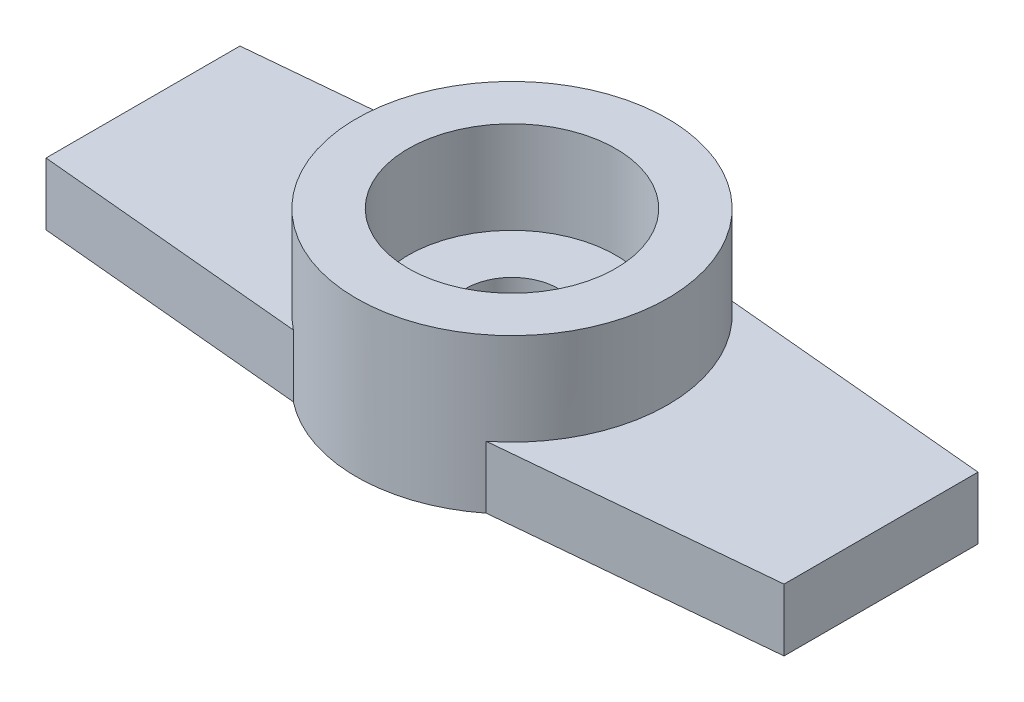
ISO-10303-21;
HEADER;
FILE_DESCRIPTION(('STEP AP214'),'2;1');
FILE_NAME('part.step','',(''),(''),'','','');
FILE_SCHEMA(('AUTOMOTIVE_DESIGN { 1 0 10303 214 1 1 1 1 }'));
ENDSEC;
DATA;
#1=APPLICATION_CONTEXT('core data for automotive mechanical design processes');
#2=APPLICATION_PROTOCOL_DEFINITION('international standard','automotive_design',2000,#1);
#3=PRODUCT_CONTEXT('',#1,'mechanical');
#4=PRODUCT('Part','Part','',(#3));
#5=PRODUCT_RELATED_PRODUCT_CATEGORY('part','',(#4));
#6=PRODUCT_DEFINITION_FORMATION('','',#4);
#7=PRODUCT_DEFINITION_CONTEXT('part definition',#1,'design');
#8=PRODUCT_DEFINITION('design','',#6,#7);
#9=PRODUCT_DEFINITION_SHAPE('','',#8);
#10=(LENGTH_UNIT() NAMED_UNIT(*) SI_UNIT(.MILLI.,.METRE.));
#11=(NAMED_UNIT(*) PLANE_ANGLE_UNIT() SI_UNIT($,.RADIAN.));
#12=(NAMED_UNIT(*) SI_UNIT($,.STERADIAN.) SOLID_ANGLE_UNIT());
#13=UNCERTAINTY_MEASURE_WITH_UNIT(LENGTH_MEASURE(1.E-05),#10,'distance_accuracy_value','');
#14=(GEOMETRIC_REPRESENTATION_CONTEXT(3) GLOBAL_UNCERTAINTY_ASSIGNED_CONTEXT((#13)) GLOBAL_UNIT_ASSIGNED_CONTEXT((#10,
#11,#12)) REPRESENTATION_CONTEXT('',''));
#15=CARTESIAN_POINT('',(0.,0.,0.));
#16=DIRECTION('',(0.,0.,1.));
#17=DIRECTION('',(1.,0.,0.));
#18=AXIS2_PLACEMENT_3D('',#15,#16,#17);
#19=CARTESIAN_POINT('',(0.,1.35,0.));
#20=DIRECTION('',(0.,1.,0.));
#21=DIRECTION('',(0.,0.,1.));
#22=AXIS2_PLACEMENT_3D('',#19,#20,#21);
#23=PLANE('',#22);
#24=CARTESIAN_POINT('',(0.,1.35,0.));
#25=DIRECTION('',(0.,1.,0.));
#26=DIRECTION('',(0.,0.,1.));
#27=AXIS2_PLACEMENT_3D('',#24,#25,#26);
#28=CIRCLE('',#27,3.375);
#29=CARTESIAN_POINT('',(2.09000598085269,1.35,2.65));
#30=VERTEX_POINT('',#29);
#31=CARTESIAN_POINT('',(2.09000598085269,1.35,-2.65));
#32=VERTEX_POINT('',#31);
#33=EDGE_CURVE('E47',#30,#32,#28,.T.);
#34=ORIENTED_EDGE('',*,*,#33,.F.);
#35=DIRECTION('',(0.995733846741475,0.,-0.0922719158434676));
#36=VECTOR('',#35,1.);
#37=CARTESIAN_POINT('',(0.26127194813818,1.35,2.81946375110068));
#38=LINE('',#37,#36);
#39=CARTESIAN_POINT('',(8.,1.35,2.10233711543026));
#40=VERTEX_POINT('',#39);
#41=EDGE_CURVE('E127',#30,#40,#38,.T.);
#42=ORIENTED_EDGE('',*,*,#41,.T.);
#43=DIRECTION('',(0.,0.,-1.));
#44=VECTOR('',#43,1.);
#45=CARTESIAN_POINT('',(8.,1.35,0.));
#46=LINE('',#45,#44);
#47=CARTESIAN_POINT('',(8.,1.35,-2.10233711543026));
#48=VERTEX_POINT('',#47);
#49=EDGE_CURVE('E55',#40,#48,#46,.T.);
#50=ORIENTED_EDGE('',*,*,#49,.T.);
#51=DIRECTION('',(0.995733846741475,0.,0.0922719158434676));
#52=VECTOR('',#51,1.);
#53=CARTESIAN_POINT('',(0.26127194813818,1.35,-2.81946375110068));
#54=LINE('',#53,#52);
#55=EDGE_CURVE('E143',#32,#48,#54,.T.);
#56=ORIENTED_EDGE('',*,*,#55,.F.);
#57=EDGE_LOOP('',(#34,#42,#50,#56));
#58=FACE_BOUND('',#57,.T.);
#59=ADVANCED_FACE('F36',(#58),#23,.T.);
#60=CARTESIAN_POINT('',(0.26127194813818,1.35,-2.81946375110068));
#61=DIRECTION('',(0.0922719158434675,0.,-0.995733846741475));
#62=DIRECTION('',(-0.995733846741475,0.,-0.0922719158434676));
#63=AXIS2_PLACEMENT_3D('',#60,#61,#62);
#64=PLANE('',#63);
#65=DIRECTION('',(0.995733846741475,0.,0.0922719158434676));
#66=VECTOR('',#65,1.);
#67=CARTESIAN_POINT('',(0.26127194813818,0.,-2.81946375110068));
#68=LINE('',#67,#66);
#69=CARTESIAN_POINT('',(2.09000598085269,0.,-2.65));
#70=VERTEX_POINT('',#69);
#71=CARTESIAN_POINT('',(8.,0.,-2.10233711543026));
#72=VERTEX_POINT('',#71);
#73=EDGE_CURVE('E151',#70,#72,#68,.T.);
#74=ORIENTED_EDGE('',*,*,#73,.F.);
#75=DIRECTION('',(0.,-1.,0.));
#76=VECTOR('',#75,1.);
#77=CARTESIAN_POINT('',(2.09000598085269,1.35,-2.65));
#78=LINE('',#77,#76);
#79=EDGE_CURVE('E40',#32,#70,#78,.T.);
#80=ORIENTED_EDGE('',*,*,#79,.F.);
#81=ORIENTED_EDGE('',*,*,#55,.T.);
#82=DIRECTION('',(0.,-1.,0.));
#83=VECTOR('',#82,1.);
#84=CARTESIAN_POINT('',(8.,1.35,-2.10233711543026));
#85=LINE('',#84,#83);
#86=EDGE_CURVE('E92',#48,#72,#85,.T.);
#87=ORIENTED_EDGE('',*,*,#86,.T.);
#88=EDGE_LOOP('',(#74,#80,#81,#87));
#89=FACE_BOUND('',#88,.T.);
#90=ADVANCED_FACE('F38',(#89),#64,.T.);
#91=CARTESIAN_POINT('',(-0.26127194813818,1.35,-2.81946375110068));
#92=DIRECTION('',(0.0922719158434675,0.,0.995733846741475));
#93=DIRECTION('',(0.995733846741475,0.,-0.0922719158434676));
#94=AXIS2_PLACEMENT_3D('',#91,#92,#93);
#95=PLANE('',#94);
#96=DIRECTION('',(-0.995733846741475,0.,0.0922719158434676));
#97=VECTOR('',#96,1.);
#98=CARTESIAN_POINT('',(-0.26127194813818,0.,-2.81946375110068));
#99=LINE('',#98,#97);
#100=CARTESIAN_POINT('',(-2.09000598085269,0.,-2.65));
#101=VERTEX_POINT('',#100);
#102=CARTESIAN_POINT('',(-8.,0.,-2.10233711543026));
#103=VERTEX_POINT('',#102);
#104=EDGE_CURVE('E156',#101,#103,#99,.T.);
#105=ORIENTED_EDGE('',*,*,#104,.T.);
#106=DIRECTION('',(0.,-1.,0.));
#107=VECTOR('',#106,1.);
#108=CARTESIAN_POINT('',(-8.,1.35,-2.10233711543026));
#109=LINE('',#108,#107);
#110=CARTESIAN_POINT('',(-8.,1.35,-2.10233711543026));
#111=VERTEX_POINT('',#110);
#112=EDGE_CURVE('E139',#111,#103,#109,.T.);
#113=ORIENTED_EDGE('',*,*,#112,.F.);
#114=DIRECTION('',(-0.995733846741475,0.,0.0922719158434676));
#115=VECTOR('',#114,1.);
#116=CARTESIAN_POINT('',(-0.26127194813818,1.35,-2.81946375110068));
#117=LINE('',#116,#115);
#118=CARTESIAN_POINT('',(-2.09000598085269,1.35,-2.65));
#119=VERTEX_POINT('',#118);
#120=EDGE_CURVE('E141',#119,#111,#117,.T.);
#121=ORIENTED_EDGE('',*,*,#120,.F.);
#122=DIRECTION('',(0.,-1.,0.));
#123=VECTOR('',#122,1.);
#124=CARTESIAN_POINT('',(-2.09000598085269,1.35,-2.65));
#125=LINE('',#124,#123);
#126=EDGE_CURVE('E132',#119,#101,#125,.T.);
#127=ORIENTED_EDGE('',*,*,#126,.T.);
#128=EDGE_LOOP('',(#105,#113,#121,#127));
#129=FACE_BOUND('',#128,.T.);
#130=ADVANCED_FACE('F142',(#129),#95,.F.);
#131=CARTESIAN_POINT('',(-8.,1.35,0.));
#132=DIRECTION('',(-1.,0.,0.));
#133=DIRECTION('',(0.,0.,1.));
#134=AXIS2_PLACEMENT_3D('',#131,#132,#133);
#135=PLANE('',#134);
#136=DIRECTION('',(0.,0.,-1.));
#137=VECTOR('',#136,1.);
#138=CARTESIAN_POINT('',(-8.,0.,0.));
#139=LINE('',#138,#137);
#140=CARTESIAN_POINT('',(-8.,0.,2.10233711543026));
#141=VERTEX_POINT('',#140);
#142=EDGE_CURVE('E159',#141,#103,#139,.T.);
#143=ORIENTED_EDGE('',*,*,#142,.F.);
#144=DIRECTION('',(0.,-1.,0.));
#145=VECTOR('',#144,1.);
#146=CARTESIAN_POINT('',(-8.,1.35,2.10233711543026));
#147=LINE('',#146,#145);
#148=CARTESIAN_POINT('',(-8.,1.35,2.10233711543026));
#149=VERTEX_POINT('',#148);
#150=EDGE_CURVE('E118',#149,#141,#147,.T.);
#151=ORIENTED_EDGE('',*,*,#150,.F.);
#152=DIRECTION('',(0.,0.,-1.));
#153=VECTOR('',#152,1.);
#154=CARTESIAN_POINT('',(-8.,1.35,0.));
#155=LINE('',#154,#153);
#156=EDGE_CURVE('E126',#149,#111,#155,.T.);
#157=ORIENTED_EDGE('',*,*,#156,.T.);
#158=ORIENTED_EDGE('',*,*,#112,.T.);
#159=EDGE_LOOP('',(#143,#151,#157,#158));
#160=FACE_BOUND('',#159,.T.);
#161=ADVANCED_FACE('F172',(#160),#135,.T.);
#162=CARTESIAN_POINT('',(-0.26127194813818,1.35,2.81946375110068));
#163=DIRECTION('',(-0.0922719158434675,0.,0.995733846741475));
#164=DIRECTION('',(0.995733846741475,0.,0.0922719158434676));
#165=AXIS2_PLACEMENT_3D('',#162,#163,#164);
#166=PLANE('',#165);
#167=DIRECTION('',(-0.995733846741475,0.,-0.0922719158434676));
#168=VECTOR('',#167,1.);
#169=CARTESIAN_POINT('',(-0.26127194813818,0.,2.81946375110068));
#170=LINE('',#169,#168);
#171=CARTESIAN_POINT('',(-2.09000598085269,0.,2.65));
#172=VERTEX_POINT('',#171);
#173=EDGE_CURVE('E115',#172,#141,#170,.T.);
#174=ORIENTED_EDGE('',*,*,#173,.F.);
#175=DIRECTION('',(0.,-1.,0.));
#176=VECTOR('',#175,1.);
#177=CARTESIAN_POINT('',(-2.09000598085269,1.35,2.65));
#178=LINE('',#177,#176);
#179=CARTESIAN_POINT('',(-2.09000598085269,1.35,2.65));
#180=VERTEX_POINT('',#179);
#181=EDGE_CURVE('E110',#180,#172,#178,.T.);
#182=ORIENTED_EDGE('',*,*,#181,.F.);
#183=DIRECTION('',(-0.995733846741475,0.,-0.0922719158434676));
#184=VECTOR('',#183,1.);
#185=CARTESIAN_POINT('',(-0.26127194813818,1.35,2.81946375110068));
#186=LINE('',#185,#184);
#187=EDGE_CURVE('E113',#180,#149,#186,.T.);
#188=ORIENTED_EDGE('',*,*,#187,.T.);
#189=ORIENTED_EDGE('',*,*,#150,.T.);
#190=EDGE_LOOP('',(#174,#182,#188,#189));
#191=FACE_BOUND('',#190,.T.);
#192=ADVANCED_FACE('F112',(#191),#166,.T.);
#193=CARTESIAN_POINT('',(0.,1.35,0.));
#194=DIRECTION('',(0.,-1.,0.));
#195=DIRECTION('',(0.,0.,-1.));
#196=AXIS2_PLACEMENT_3D('',#193,#194,#195);
#197=CYLINDRICAL_SURFACE('',#196,3.375);
#198=CARTESIAN_POINT('',(0.,0.,0.));
#199=DIRECTION('',(0.,1.,0.));
#200=DIRECTION('',(0.,0.,1.));
#201=AXIS2_PLACEMENT_3D('',#198,#199,#200);
#202=CIRCLE('',#201,3.375);
#203=CARTESIAN_POINT('',(2.09000598085269,0.,2.65));
#204=VERTEX_POINT('',#203);
#205=EDGE_CURVE('E157',#172,#204,#202,.T.);
#206=ORIENTED_EDGE('',*,*,#205,.T.);
#207=DIRECTION('',(0.,-1.,0.));
#208=VECTOR('',#207,1.);
#209=CARTESIAN_POINT('',(2.09000598085269,1.35,2.65));
#210=LINE('',#209,#208);
#211=EDGE_CURVE('E119',#30,#204,#210,.T.);
#212=ORIENTED_EDGE('',*,*,#211,.F.);
#213=ORIENTED_EDGE('',*,*,#33,.T.);
#214=ORIENTED_EDGE('',*,*,#79,.T.);
#215=EDGE_CURVE('E135',#70,#101,#202,.T.);
#216=ORIENTED_EDGE('',*,*,#215,.T.);
#217=ORIENTED_EDGE('',*,*,#126,.F.);
#218=EDGE_CURVE('E11',#119,#180,#28,.T.);
#219=ORIENTED_EDGE('',*,*,#218,.T.);
#220=ORIENTED_EDGE('',*,*,#181,.T.);
#221=EDGE_LOOP('',(#206,#212,#213,#214,#216,#217,#219,#220));
#222=FACE_BOUND('',#221,.T.);
#223=CARTESIAN_POINT('',(0.,3.35,0.));
#224=DIRECTION('',(0.,1.,0.));
#225=DIRECTION('',(0.,0.,1.));
#226=AXIS2_PLACEMENT_3D('',#223,#224,#225);
#227=CIRCLE('',#226,3.375);
#228=CARTESIAN_POINT('',(0.,3.35,3.375));
#229=VERTEX_POINT('',#228);
#230=EDGE_CURVE('E154',#229,#229,#227,.T.);
#231=ORIENTED_EDGE('',*,*,#230,.F.);
#232=EDGE_LOOP('',(#231));
#233=FACE_BOUND('',#232,.T.);
#234=ADVANCED_FACE('F129',(#222,#233),#197,.T.);
#235=CARTESIAN_POINT('',(0.26127194813818,1.35,2.81946375110068));
#236=DIRECTION('',(-0.0922719158434675,0.,-0.995733846741475));
#237=DIRECTION('',(-0.995733846741475,0.,0.0922719158434676));
#238=AXIS2_PLACEMENT_3D('',#235,#236,#237);
#239=PLANE('',#238);
#240=DIRECTION('',(0.995733846741475,0.,-0.0922719158434676));
#241=VECTOR('',#240,1.);
#242=CARTESIAN_POINT('',(0.26127194813818,0.,2.81946375110068));
#243=LINE('',#242,#241);
#244=CARTESIAN_POINT('',(8.,0.,2.10233711543026));
#245=VERTEX_POINT('',#244);
#246=EDGE_CURVE('E85',#204,#245,#243,.T.);
#247=ORIENTED_EDGE('',*,*,#246,.T.);
#248=DIRECTION('',(0.,-1.,0.));
#249=VECTOR('',#248,1.);
#250=CARTESIAN_POINT('',(8.,1.35,2.10233711543026));
#251=LINE('',#250,#249);
#252=EDGE_CURVE('E166',#40,#245,#251,.T.);
#253=ORIENTED_EDGE('',*,*,#252,.F.);
#254=ORIENTED_EDGE('',*,*,#41,.F.);
#255=ORIENTED_EDGE('',*,*,#211,.T.);
#256=EDGE_LOOP('',(#247,#253,#254,#255));
#257=FACE_BOUND('',#256,.T.);
#258=ADVANCED_FACE('F180',(#257),#239,.F.);
#259=CARTESIAN_POINT('',(8.,1.35,0.));
#260=DIRECTION('',(-1.,0.,0.));
#261=DIRECTION('',(0.,0.,1.));
#262=AXIS2_PLACEMENT_3D('',#259,#260,#261);
#263=PLANE('',#262);
#264=DIRECTION('',(0.,0.,-1.));
#265=VECTOR('',#264,1.);
#266=CARTESIAN_POINT('',(8.,0.,0.));
#267=LINE('',#266,#265);
#268=EDGE_CURVE('E146',#245,#72,#267,.T.);
#269=ORIENTED_EDGE('',*,*,#268,.T.);
#270=ORIENTED_EDGE('',*,*,#86,.F.);
#271=ORIENTED_EDGE('',*,*,#49,.F.);
#272=ORIENTED_EDGE('',*,*,#252,.T.);
#273=EDGE_LOOP('',(#269,#270,#271,#272));
#274=FACE_BOUND('',#273,.T.);
#275=ADVANCED_FACE('F227',(#274),#263,.F.);
#276=ORIENTED_EDGE('',*,*,#218,.F.);
#277=ORIENTED_EDGE('',*,*,#120,.T.);
#278=ORIENTED_EDGE('',*,*,#156,.F.);
#279=ORIENTED_EDGE('',*,*,#187,.F.);
#280=EDGE_LOOP('',(#276,#277,#278,#279));
#281=FACE_BOUND('',#280,.T.);
#282=ADVANCED_FACE('F123',(#281),#23,.T.);
#283=CARTESIAN_POINT('',(0.,0.,0.));
#284=DIRECTION('',(0.,1.,0.));
#285=DIRECTION('',(0.,0.,1.));
#286=AXIS2_PLACEMENT_3D('',#283,#284,#285);
#287=PLANE('',#286);
#288=CARTESIAN_POINT('',(0.,0.,0.));
#289=DIRECTION('',(0.,1.,0.));
#290=DIRECTION('',(0.,0.,1.));
#291=AXIS2_PLACEMENT_3D('',#288,#289,#290);
#292=CIRCLE('',#291,1.);
#293=CARTESIAN_POINT('',(0.,0.,1.));
#294=VERTEX_POINT('',#293);
#295=EDGE_CURVE('E189',#294,#294,#292,.T.);
#296=ORIENTED_EDGE('',*,*,#295,.T.);
#297=EDGE_LOOP('',(#296));
#298=FACE_BOUND('',#297,.T.);
#299=ORIENTED_EDGE('',*,*,#73,.T.);
#300=ORIENTED_EDGE('',*,*,#268,.F.);
#301=ORIENTED_EDGE('',*,*,#246,.F.);
#302=ORIENTED_EDGE('',*,*,#205,.F.);
#303=ORIENTED_EDGE('',*,*,#173,.T.);
#304=ORIENTED_EDGE('',*,*,#142,.T.);
#305=ORIENTED_EDGE('',*,*,#104,.F.);
#306=ORIENTED_EDGE('',*,*,#215,.F.);
#307=EDGE_LOOP('',(#299,#300,#301,#302,#303,#304,#305,#306));
#308=FACE_BOUND('',#307,.T.);
#309=ADVANCED_FACE('F174',(#298,#308),#287,.F.);
#310=CARTESIAN_POINT('',(0.,3.35,0.));
#311=DIRECTION('',(0.,1.,0.));
#312=DIRECTION('',(0.,0.,1.));
#313=AXIS2_PLACEMENT_3D('',#310,#311,#312);
#314=PLANE('',#313);
#315=CARTESIAN_POINT('',(0.,3.35,0.));
#316=DIRECTION('',(0.,1.,0.));
#317=DIRECTION('',(0.,0.,1.));
#318=AXIS2_PLACEMENT_3D('',#315,#316,#317);
#319=CIRCLE('',#318,2.25);
#320=CARTESIAN_POINT('',(0.,3.35,2.25));
#321=VERTEX_POINT('',#320);
#322=EDGE_CURVE('E185',#321,#321,#319,.T.);
#323=ORIENTED_EDGE('',*,*,#322,.F.);
#324=EDGE_LOOP('',(#323));
#325=FACE_BOUND('',#324,.T.);
#326=ORIENTED_EDGE('',*,*,#230,.T.);
#327=EDGE_LOOP('',(#326));
#328=FACE_BOUND('',#327,.T.);
#329=ADVANCED_FACE('F213',(#325,#328),#314,.T.);
#330=CARTESIAN_POINT('',(0.,1.35,0.));
#331=DIRECTION('',(0.,1.,0.));
#332=DIRECTION('',(0.,0.,1.));
#333=AXIS2_PLACEMENT_3D('',#330,#331,#332);
#334=CYLINDRICAL_SURFACE('',#333,2.25);
#335=CARTESIAN_POINT('',(0.,1.35,0.));
#336=DIRECTION('',(0.,1.,0.));
#337=DIRECTION('',(0.,0.,1.));
#338=AXIS2_PLACEMENT_3D('',#335,#336,#337);
#339=CIRCLE('',#338,2.25);
#340=CARTESIAN_POINT('',(0.,1.35,2.25));
#341=VERTEX_POINT('',#340);
#342=EDGE_CURVE('E181',#341,#341,#339,.T.);
#343=ORIENTED_EDGE('',*,*,#342,.F.);
#344=EDGE_LOOP('',(#343));
#345=FACE_BOUND('',#344,.T.);
#346=ORIENTED_EDGE('',*,*,#322,.T.);
#347=EDGE_LOOP('',(#346));
#348=FACE_BOUND('',#347,.T.);
#349=ADVANCED_FACE('F207',(#345,#348),#334,.F.);
#350=CARTESIAN_POINT('',(0.,1.35,0.));
#351=DIRECTION('',(0.,1.,0.));
#352=DIRECTION('',(0.,0.,1.));
#353=AXIS2_PLACEMENT_3D('',#350,#351,#352);
#354=PLANE('',#353);
#355=CARTESIAN_POINT('',(0.,1.35,0.));
#356=DIRECTION('',(0.,1.,0.));
#357=DIRECTION('',(0.,0.,1.));
#358=AXIS2_PLACEMENT_3D('',#355,#356,#357);
#359=CIRCLE('',#358,1.);
#360=CARTESIAN_POINT('',(0.,1.35,1.));
#361=VERTEX_POINT('',#360);
#362=EDGE_CURVE('E191',#361,#361,#359,.T.);
#363=ORIENTED_EDGE('',*,*,#362,.F.);
#364=EDGE_LOOP('',(#363));
#365=FACE_BOUND('',#364,.T.);
#366=ORIENTED_EDGE('',*,*,#342,.T.);
#367=EDGE_LOOP('',(#366));
#368=FACE_BOUND('',#367,.T.);
#369=ADVANCED_FACE('F201',(#365,#368),#354,.T.);
#370=CARTESIAN_POINT('',(0.,0.,0.));
#371=DIRECTION('',(0.,1.,0.));
#372=DIRECTION('',(0.,0.,1.));
#373=AXIS2_PLACEMENT_3D('',#370,#371,#372);
#374=CYLINDRICAL_SURFACE('',#373,1.);
#375=CARTESIAN_POINT('',(0.,0.,1.));
#376=CARTESIAN_POINT('',(0.,0.0140625,1.));
#377=CARTESIAN_POINT('',(0.,0.028125,1.));
#378=CARTESIAN_POINT('',(0.,0.05625,1.));
#379=CARTESIAN_POINT('',(0.,0.0703125,1.));
#380=CARTESIAN_POINT('',(0.,0.0984375,1.));
#381=CARTESIAN_POINT('',(0.,0.1125,1.));
#382=CARTESIAN_POINT('',(0.,0.140625,1.));
#383=CARTESIAN_POINT('',(0.,0.1546875,1.));
#384=CARTESIAN_POINT('',(0.,0.1828125,1.));
#385=CARTESIAN_POINT('',(0.,0.196875,1.));
#386=CARTESIAN_POINT('',(0.,0.225,1.));
#387=CARTESIAN_POINT('',(0.,0.2390625,1.));
#388=CARTESIAN_POINT('',(0.,0.2671875,1.));
#389=CARTESIAN_POINT('',(0.,0.28125,1.));
#390=CARTESIAN_POINT('',(0.,0.309375,1.));
#391=CARTESIAN_POINT('',(0.,0.3234375,1.));
#392=CARTESIAN_POINT('',(0.,0.3515625,1.));
#393=CARTESIAN_POINT('',(0.,0.365625,1.));
#394=CARTESIAN_POINT('',(0.,0.39375,1.));
#395=CARTESIAN_POINT('',(0.,0.4078125,1.));
#396=CARTESIAN_POINT('',(0.,0.4359375,1.));
#397=CARTESIAN_POINT('',(0.,0.45,1.));
#398=CARTESIAN_POINT('',(0.,0.478125,1.));
#399=CARTESIAN_POINT('',(0.,0.4921875,1.));
#400=CARTESIAN_POINT('',(0.,0.5203125,1.));
#401=CARTESIAN_POINT('',(0.,0.534375,1.));
#402=CARTESIAN_POINT('',(0.,0.5625,1.));
#403=CARTESIAN_POINT('',(0.,0.5765625,1.));
#404=CARTESIAN_POINT('',(0.,0.6046875,1.));
#405=CARTESIAN_POINT('',(0.,0.61875,1.));
#406=CARTESIAN_POINT('',(0.,0.646875,1.));
#407=CARTESIAN_POINT('',(0.,0.6609375,1.));
#408=CARTESIAN_POINT('',(0.,0.6890625,1.));
#409=CARTESIAN_POINT('',(0.,0.703125,1.));
#410=CARTESIAN_POINT('',(0.,0.73125,1.));
#411=CARTESIAN_POINT('',(0.,0.7453125,1.));
#412=CARTESIAN_POINT('',(0.,0.7734375,1.));
#413=CARTESIAN_POINT('',(0.,0.7875,1.));
#414=CARTESIAN_POINT('',(0.,0.815625,1.));
#415=CARTESIAN_POINT('',(0.,0.8296875,1.));
#416=CARTESIAN_POINT('',(0.,0.8578125,1.));
#417=CARTESIAN_POINT('',(0.,0.871875,1.));
#418=CARTESIAN_POINT('',(0.,0.9,1.));
#419=CARTESIAN_POINT('',(0.,0.9140625,1.));
#420=CARTESIAN_POINT('',(0.,0.9421875,1.));
#421=CARTESIAN_POINT('',(0.,0.95625,1.));
#422=CARTESIAN_POINT('',(0.,0.984375,1.));
#423=CARTESIAN_POINT('',(0.,0.9984375,1.));
#424=CARTESIAN_POINT('',(0.,1.0265625,1.));
#425=CARTESIAN_POINT('',(0.,1.040625,1.));
#426=CARTESIAN_POINT('',(0.,1.06875,1.));
#427=CARTESIAN_POINT('',(0.,1.0828125,1.));
#428=CARTESIAN_POINT('',(0.,1.1109375,1.));
#429=CARTESIAN_POINT('',(0.,1.125,1.));
#430=CARTESIAN_POINT('',(0.,1.153125,1.));
#431=CARTESIAN_POINT('',(0.,1.1671875,1.));
#432=CARTESIAN_POINT('',(0.,1.1953125,1.));
#433=CARTESIAN_POINT('',(0.,1.209375,1.));
#434=CARTESIAN_POINT('',(0.,1.2375,1.));
#435=CARTESIAN_POINT('',(0.,1.2515625,1.));
#436=CARTESIAN_POINT('',(0.,1.2796875,1.));
#437=CARTESIAN_POINT('',(0.,1.29375,1.));
#438=CARTESIAN_POINT('',(0.,1.321875,1.));
#439=CARTESIAN_POINT('',(0.,1.3359375,1.));
#440=CARTESIAN_POINT('',(0.,1.35,1.));
#441=B_SPLINE_CURVE_WITH_KNOTS('',3,(#375,#376,#377,#378,#379,#380,#381,#382,#383,#384,#385,
#386,#387,#388,#389,#390,#391,#392,#393,#394,#395,#396,#397,#398,#399,#400,#401,#402,#403,#404,
#405,#406,#407,#408,#409,#410,#411,#412,#413,#414,#415,#416,#417,#418,#419,#420,#421,#422,#423,
#424,#425,#426,#427,#428,#429,#430,#431,#432,#433,#434,#435,#436,#437,#438,#439,#440),
.UNSPECIFIED.,.F.,.F.,(4,2,2,2,2,2,2,2,2,2,2,2,2,2,2,2,2,2,2,2,2,2,2,2,2,2,2,2,2,2,2,2,4),(0.,
0.0421875,0.084375,0.1265625,0.16875,0.2109375,0.253125,0.2953125,0.3375,0.3796875,0.421875,
0.4640625,0.50625,0.5484375,0.590625,0.6328125,0.675,0.7171875,0.759375,0.8015625,0.84375,
0.8859375,0.928125,0.9703125,1.0125,1.0546875,1.096875,1.1390625,1.18125,1.2234375,1.265625,
1.3078125,1.35),.UNSPECIFIED.);
#442=EDGE_CURVE('BSEAM198',#294,#361,#441,.T.);
#443=ORIENTED_EDGE('',*,*,#295,.F.);
#444=ORIENTED_EDGE('',*,*,#362,.T.);
#445=ORIENTED_EDGE('',*,*,#442,.T.);
#446=ORIENTED_EDGE('',*,*,#442,.F.);
#447=EDGE_LOOP('',(#443,#445,#444,#446));
#448=FACE_BOUND('',#447,.T.);
#449=ADVANCED_FACE('F198',(#448),#374,.F.);
#450=CLOSED_SHELL('',(#59,#90,#130,#161,#192,#234,#258,#275,#282,#309,#329,#349,#369,#449));
#451=MANIFOLD_SOLID_BREP('B2',#450);
#452=ADVANCED_BREP_SHAPE_REPRESENTATION('',(#18,#451),#14);
#453=SHAPE_DEFINITION_REPRESENTATION(#9,#452);
ENDSEC;
END-ISO-10303-21;
